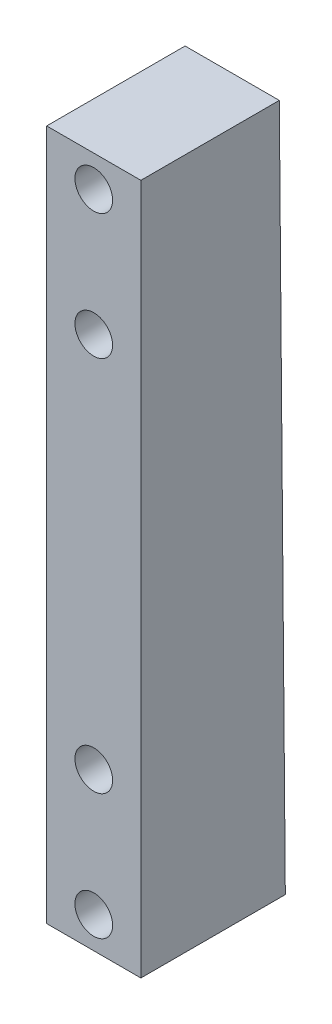
ISO-10303-21;
HEADER;
FILE_DESCRIPTION(('STEP AP214'),'2;1');
FILE_NAME('part.step','',(''),(''),'','','');
FILE_SCHEMA(('AUTOMOTIVE_DESIGN { 1 0 10303 214 1 1 1 1 }'));
ENDSEC;
DATA;
#1=APPLICATION_CONTEXT('core data for automotive mechanical design processes');
#2=APPLICATION_PROTOCOL_DEFINITION('international standard','automotive_design',2000,#1);
#3=PRODUCT_CONTEXT('',#1,'mechanical');
#4=PRODUCT('Part','Part','',(#3));
#5=PRODUCT_RELATED_PRODUCT_CATEGORY('part','',(#4));
#6=PRODUCT_DEFINITION_FORMATION('','',#4);
#7=PRODUCT_DEFINITION_CONTEXT('part definition',#1,'design');
#8=PRODUCT_DEFINITION('design','',#6,#7);
#9=PRODUCT_DEFINITION_SHAPE('','',#8);
#10=(LENGTH_UNIT() NAMED_UNIT(*) SI_UNIT(.MILLI.,.METRE.));
#11=(NAMED_UNIT(*) PLANE_ANGLE_UNIT() SI_UNIT($,.RADIAN.));
#12=(NAMED_UNIT(*) SI_UNIT($,.STERADIAN.) SOLID_ANGLE_UNIT());
#13=UNCERTAINTY_MEASURE_WITH_UNIT(LENGTH_MEASURE(1.E-05),#10,'distance_accuracy_value','');
#14=(GEOMETRIC_REPRESENTATION_CONTEXT(3) GLOBAL_UNCERTAINTY_ASSIGNED_CONTEXT((#13)) GLOBAL_UNIT_ASSIGNED_CONTEXT((#10,
#11,#12)) REPRESENTATION_CONTEXT('',''));
#15=CARTESIAN_POINT('',(0.,0.,0.));
#16=DIRECTION('',(0.,0.,1.));
#17=DIRECTION('',(1.,0.,0.));
#18=AXIS2_PLACEMENT_3D('',#15,#16,#17);
#19=CARTESIAN_POINT('',(7.5,-55.,0.));
#20=DIRECTION('',(0.,0.,1.));
#21=DIRECTION('',(1.,0.,0.));
#22=AXIS2_PLACEMENT_3D('',#19,#20,#21);
#23=PLANE('',#22);
#24=CARTESIAN_POINT('',(0.,50.,0.));
#25=DIRECTION('',(0.,0.,1.));
#26=DIRECTION('',(1.,0.,0.));
#27=AXIS2_PLACEMENT_3D('',#24,#25,#26);
#28=CIRCLE('',#27,3.);
#29=CARTESIAN_POINT('',(3.,50.,0.));
#30=VERTEX_POINT('',#29);
#31=EDGE_CURVE('E120',#30,#30,#28,.T.);
#32=ORIENTED_EDGE('',*,*,#31,.F.);
#33=EDGE_LOOP('',(#32));
#34=FACE_BOUND('',#33,.T.);
#35=CARTESIAN_POINT('',(0.,-50.,0.));
#36=DIRECTION('',(0.,0.,1.));
#37=DIRECTION('',(1.,0.,0.));
#38=AXIS2_PLACEMENT_3D('',#35,#36,#37);
#39=CIRCLE('',#38,3.);
#40=CARTESIAN_POINT('',(3.,-50.,0.));
#41=VERTEX_POINT('',#40);
#42=EDGE_CURVE('E111',#41,#41,#39,.T.);
#43=ORIENTED_EDGE('',*,*,#42,.F.);
#44=EDGE_LOOP('',(#43));
#45=FACE_BOUND('',#44,.T.);
#46=CARTESIAN_POINT('',(0.,30.,0.));
#47=DIRECTION('',(0.,0.,1.));
#48=DIRECTION('',(1.,0.,0.));
#49=AXIS2_PLACEMENT_3D('',#46,#47,#48);
#50=CIRCLE('',#49,2.99999999999999);
#51=CARTESIAN_POINT('',(2.99999999999999,30.,0.));
#52=VERTEX_POINT('',#51);
#53=EDGE_CURVE('E102',#52,#52,#50,.T.);
#54=ORIENTED_EDGE('',*,*,#53,.F.);
#55=EDGE_LOOP('',(#54));
#56=FACE_BOUND('',#55,.T.);
#57=CARTESIAN_POINT('',(0.,-30.,0.));
#58=DIRECTION('',(0.,0.,1.));
#59=DIRECTION('',(1.,0.,0.));
#60=AXIS2_PLACEMENT_3D('',#57,#58,#59);
#61=CIRCLE('',#60,2.99999999999999);
#62=CARTESIAN_POINT('',(2.99999999999999,-30.,0.));
#63=VERTEX_POINT('',#62);
#64=EDGE_CURVE('E96',#63,#63,#61,.T.);
#65=ORIENTED_EDGE('',*,*,#64,.F.);
#66=EDGE_LOOP('',(#65));
#67=FACE_BOUND('',#66,.T.);
#68=DIRECTION('',(0.,1.,0.));
#69=VECTOR('',#68,1.);
#70=CARTESIAN_POINT('',(-7.5,-55.,0.));
#71=LINE('',#70,#69);
#72=CARTESIAN_POINT('',(-7.5,-55.,0.));
#73=VERTEX_POINT('',#72);
#74=CARTESIAN_POINT('',(-7.5,55.,0.));
#75=VERTEX_POINT('',#74);
#76=EDGE_CURVE('E74',#73,#75,#71,.T.);
#77=ORIENTED_EDGE('',*,*,#76,.F.);
#78=DIRECTION('',(-1.,0.,0.));
#79=VECTOR('',#78,1.);
#80=CARTESIAN_POINT('',(7.5,-55.,0.));
#81=LINE('',#80,#79);
#82=CARTESIAN_POINT('',(7.5,-55.,0.));
#83=VERTEX_POINT('',#82);
#84=EDGE_CURVE('E11',#83,#73,#81,.T.);
#85=ORIENTED_EDGE('',*,*,#84,.F.);
#86=DIRECTION('',(0.,1.,0.));
#87=VECTOR('',#86,1.);
#88=CARTESIAN_POINT('',(7.5,-55.,0.));
#89=LINE('',#88,#87);
#90=CARTESIAN_POINT('',(7.5,55.,0.));
#91=VERTEX_POINT('',#90);
#92=EDGE_CURVE('E84',#83,#91,#89,.T.);
#93=ORIENTED_EDGE('',*,*,#92,.T.);
#94=DIRECTION('',(-1.,0.,0.));
#95=VECTOR('',#94,1.);
#96=CARTESIAN_POINT('',(7.5,55.,0.));
#97=LINE('',#96,#95);
#98=EDGE_CURVE('E75',#91,#75,#97,.T.);
#99=ORIENTED_EDGE('',*,*,#98,.T.);
#100=EDGE_LOOP('',(#77,#85,#93,#99));
#101=FACE_BOUND('',#100,.T.);
#102=ADVANCED_FACE('F33',(#34,#45,#56,#67,#101),#23,.T.);
#103=CARTESIAN_POINT('',(7.5,-55.,-23.));
#104=DIRECTION('',(0.,-1.,0.));
#105=DIRECTION('',(0.,0.,-1.));
#106=AXIS2_PLACEMENT_3D('',#103,#104,#105);
#107=PLANE('',#106);
#108=DIRECTION('',(0.,0.,1.));
#109=VECTOR('',#108,1.);
#110=CARTESIAN_POINT('',(-7.5,-55.,-23.));
#111=LINE('',#110,#109);
#112=CARTESIAN_POINT('',(-7.5,-55.,-23.));
#113=VERTEX_POINT('',#112);
#114=EDGE_CURVE('E70',#113,#73,#111,.T.);
#115=ORIENTED_EDGE('',*,*,#114,.F.);
#116=DIRECTION('',(-1.,0.,0.));
#117=VECTOR('',#116,1.);
#118=CARTESIAN_POINT('',(7.5,-55.,-23.));
#119=LINE('',#118,#117);
#120=CARTESIAN_POINT('',(7.5,-55.,-23.));
#121=VERTEX_POINT('',#120);
#122=EDGE_CURVE('E42',#121,#113,#119,.T.);
#123=ORIENTED_EDGE('',*,*,#122,.F.);
#124=DIRECTION('',(0.,0.,1.));
#125=VECTOR('',#124,1.);
#126=CARTESIAN_POINT('',(7.5,-55.,-23.));
#127=LINE('',#126,#125);
#128=EDGE_CURVE('E72',#121,#83,#127,.T.);
#129=ORIENTED_EDGE('',*,*,#128,.T.);
#130=ORIENTED_EDGE('',*,*,#84,.T.);
#131=EDGE_LOOP('',(#115,#123,#129,#130));
#132=FACE_BOUND('',#131,.T.);
#133=ADVANCED_FACE('F68',(#132),#107,.T.);
#134=CARTESIAN_POINT('',(7.5,55.,0.));
#135=DIRECTION('',(0.,1.,0.));
#136=DIRECTION('',(0.,0.,1.));
#137=AXIS2_PLACEMENT_3D('',#134,#135,#136);
#138=PLANE('',#137);
#139=DIRECTION('',(1.,0.,0.));
#140=VECTOR('',#139,1.);
#141=CARTESIAN_POINT('',(-7.5,55.,-22.0400445430173));
#142=LINE('',#141,#140);
#143=CARTESIAN_POINT('',(-7.5,55.,-22.0400445430173));
#144=VERTEX_POINT('',#143);
#145=CARTESIAN_POINT('',(7.5,55.,-22.0400445430173));
#146=VERTEX_POINT('',#145);
#147=EDGE_CURVE('E126',#144,#146,#142,.T.);
#148=ORIENTED_EDGE('',*,*,#147,.F.);
#149=DIRECTION('',(0.,0.,-1.));
#150=VECTOR('',#149,1.);
#151=CARTESIAN_POINT('',(-7.5,55.,0.));
#152=LINE('',#151,#150);
#153=EDGE_CURVE('E79',#75,#144,#152,.T.);
#154=ORIENTED_EDGE('',*,*,#153,.F.);
#155=ORIENTED_EDGE('',*,*,#98,.F.);
#156=DIRECTION('',(0.,0.,-1.));
#157=VECTOR('',#156,1.);
#158=CARTESIAN_POINT('',(7.5,55.,0.));
#159=LINE('',#158,#157);
#160=EDGE_CURVE('E86',#91,#146,#159,.T.);
#161=ORIENTED_EDGE('',*,*,#160,.T.);
#162=EDGE_LOOP('',(#148,#154,#155,#161));
#163=FACE_BOUND('',#162,.T.);
#164=ADVANCED_FACE('F143',(#163),#138,.T.);
#165=CARTESIAN_POINT('',(7.5,0.,0.));
#166=DIRECTION('',(-1.,0.,0.));
#167=DIRECTION('',(0.,0.,1.));
#168=AXIS2_PLACEMENT_3D('',#165,#166,#167);
#169=PLANE('',#168);
#170=ORIENTED_EDGE('',*,*,#128,.F.);
#171=DIRECTION('',(0.,-0.999961923064171,-0.008726535498367));
#172=VECTOR('',#171,1.);
#173=CARTESIAN_POINT('',(7.5,-55.,-23.));
#174=LINE('',#173,#172);
#175=EDGE_CURVE('E129',#146,#121,#174,.T.);
#176=ORIENTED_EDGE('',*,*,#175,.F.);
#177=ORIENTED_EDGE('',*,*,#160,.F.);
#178=ORIENTED_EDGE('',*,*,#92,.F.);
#179=EDGE_LOOP('',(#170,#176,#177,#178));
#180=FACE_BOUND('',#179,.T.);
#181=ADVANCED_FACE('F141',(#180),#169,.F.);
#182=CARTESIAN_POINT('',(-7.5,0.,0.));
#183=DIRECTION('',(-1.,0.,0.));
#184=DIRECTION('',(0.,0.,1.));
#185=AXIS2_PLACEMENT_3D('',#182,#183,#184);
#186=PLANE('',#185);
#187=DIRECTION('',(0.,-0.999961923064171,-0.008726535498367));
#188=VECTOR('',#187,1.);
#189=CARTESIAN_POINT('',(-7.5,-55.,-23.));
#190=LINE('',#189,#188);
#191=EDGE_CURVE('E83',#144,#113,#190,.T.);
#192=ORIENTED_EDGE('',*,*,#191,.T.);
#193=ORIENTED_EDGE('',*,*,#114,.T.);
#194=ORIENTED_EDGE('',*,*,#76,.T.);
#195=ORIENTED_EDGE('',*,*,#153,.T.);
#196=EDGE_LOOP('',(#192,#193,#194,#195));
#197=FACE_BOUND('',#196,.T.);
#198=ADVANCED_FACE('F82',(#197),#186,.T.);
#199=CARTESIAN_POINT('',(0.,-30.,-6.01));
#200=DIRECTION('',(0.,0.,1.));
#201=DIRECTION('',(1.,0.,0.));
#202=AXIS2_PLACEMENT_3D('',#199,#200,#201);
#203=CONICAL_SURFACE('',#202,2.99999999999999,1.0297442586969);
#204=CARTESIAN_POINT('',(0.,-30.,-7.812581857));
#205=VERTEX_POINT('',#204);
#206=VERTEX_LOOP('',#205);
#207=FACE_BOUND('',#206,.T.);
#208=CARTESIAN_POINT('',(0.,-30.,-6.01));
#209=DIRECTION('',(0.,0.,1.));
#210=DIRECTION('',(1.,0.,0.));
#211=AXIS2_PLACEMENT_3D('',#208,#209,#210);
#212=CIRCLE('',#211,2.99999999999999);
#213=CARTESIAN_POINT('',(2.99999999999999,-30.,-6.01));
#214=VERTEX_POINT('',#213);
#215=EDGE_CURVE('E80',#214,#214,#212,.T.);
#216=ORIENTED_EDGE('',*,*,#215,.T.);
#217=EDGE_LOOP('',(#216));
#218=FACE_BOUND('',#217,.T.);
#219=ADVANCED_FACE('F151',(#207,#218),#203,.F.);
#220=CARTESIAN_POINT('',(0.,-30.,0.));
#221=DIRECTION('',(0.,0.,1.));
#222=DIRECTION('',(1.,0.,0.));
#223=AXIS2_PLACEMENT_3D('',#220,#221,#222);
#224=CYLINDRICAL_SURFACE('',#223,2.99999999999999);
#225=ORIENTED_EDGE('',*,*,#215,.F.);
#226=EDGE_LOOP('',(#225));
#227=FACE_BOUND('',#226,.T.);
#228=ORIENTED_EDGE('',*,*,#64,.T.);
#229=EDGE_LOOP('',(#228));
#230=FACE_BOUND('',#229,.T.);
#231=ADVANCED_FACE('F154',(#227,#230),#224,.F.);
#232=CARTESIAN_POINT('',(0.,30.,-6.01));
#233=DIRECTION('',(0.,0.,1.));
#234=DIRECTION('',(1.,0.,0.));
#235=AXIS2_PLACEMENT_3D('',#232,#233,#234);
#236=CONICAL_SURFACE('',#235,2.99999999999999,1.0297442586969);
#237=CARTESIAN_POINT('',(0.,30.,-7.812581857));
#238=VERTEX_POINT('',#237);
#239=VERTEX_LOOP('',#238);
#240=FACE_BOUND('',#239,.T.);
#241=CARTESIAN_POINT('',(0.,30.,-6.01));
#242=DIRECTION('',(0.,0.,1.));
#243=DIRECTION('',(1.,0.,0.));
#244=AXIS2_PLACEMENT_3D('',#241,#242,#243);
#245=CIRCLE('',#244,2.99999999999999);
#246=CARTESIAN_POINT('',(2.99999999999999,30.,-6.01));
#247=VERTEX_POINT('',#246);
#248=EDGE_CURVE('E99',#247,#247,#245,.T.);
#249=ORIENTED_EDGE('',*,*,#248,.T.);
#250=EDGE_LOOP('',(#249));
#251=FACE_BOUND('',#250,.T.);
#252=ADVANCED_FACE('F160',(#240,#251),#236,.F.);
#253=CARTESIAN_POINT('',(0.,30.,0.));
#254=DIRECTION('',(0.,0.,1.));
#255=DIRECTION('',(1.,0.,0.));
#256=AXIS2_PLACEMENT_3D('',#253,#254,#255);
#257=CYLINDRICAL_SURFACE('',#256,2.99999999999999);
#258=ORIENTED_EDGE('',*,*,#248,.F.);
#259=EDGE_LOOP('',(#258));
#260=FACE_BOUND('',#259,.T.);
#261=ORIENTED_EDGE('',*,*,#53,.T.);
#262=EDGE_LOOP('',(#261));
#263=FACE_BOUND('',#262,.T.);
#264=ADVANCED_FACE('F177',(#260,#263),#257,.F.);
#265=CARTESIAN_POINT('',(0.,-50.,0.));
#266=DIRECTION('',(0.,0.,1.));
#267=DIRECTION('',(1.,0.,0.));
#268=AXIS2_PLACEMENT_3D('',#265,#266,#267);
#269=CYLINDRICAL_SURFACE('',#268,2.10000000000001);
#270=CARTESIAN_POINT('',(0.,-50.,-22.9563656610462));
#271=DIRECTION('',(0.,-0.008726535498367,0.999961923064171));
#272=DIRECTION('',(0.,0.999961923064171,0.008726535498367));
#273=AXIS2_PLACEMENT_3D('',#270,#271,#272);
#274=ELLIPSE('',#273,2.10007996461005,2.10000000000001);
#275=CARTESIAN_POINT('',(0.,-47.9,-22.9380392386857));
#276=VERTEX_POINT('',#275);
#277=EDGE_CURVE('E123',#276,#276,#274,.F.);
#278=ORIENTED_EDGE('',*,*,#277,.T.);
#279=EDGE_LOOP('',(#278));
#280=FACE_BOUND('',#279,.T.);
#281=CARTESIAN_POINT('',(0.,-50.,-6.54077455899997));
#282=DIRECTION('',(0.,0.,1.));
#283=DIRECTION('',(1.,0.,0.));
#284=AXIS2_PLACEMENT_3D('',#281,#282,#283);
#285=CIRCLE('',#284,2.10000000000001);
#286=CARTESIAN_POINT('',(2.10000000000001,-50.,-6.54077455899997));
#287=VERTEX_POINT('',#286);
#288=EDGE_CURVE('E105',#287,#287,#285,.T.);
#289=ORIENTED_EDGE('',*,*,#288,.T.);
#290=EDGE_LOOP('',(#289));
#291=FACE_BOUND('',#290,.T.);
#292=ADVANCED_FACE('F179',(#280,#291),#269,.F.);
#293=CARTESIAN_POINT('',(0.,-50.,-6.));
#294=DIRECTION('',(0.,0.,1.));
#295=DIRECTION('',(1.,0.,0.));
#296=AXIS2_PLACEMENT_3D('',#293,#294,#295);
#297=CONICAL_SURFACE('',#296,3.,1.02974425714581);
#298=ORIENTED_EDGE('',*,*,#288,.F.);
#299=EDGE_LOOP('',(#298));
#300=FACE_BOUND('',#299,.T.);
#301=CARTESIAN_POINT('',(0.,-50.,-6.));
#302=DIRECTION('',(0.,0.,1.));
#303=DIRECTION('',(1.,0.,0.));
#304=AXIS2_PLACEMENT_3D('',#301,#302,#303);
#305=CIRCLE('',#304,3.);
#306=CARTESIAN_POINT('',(3.,-50.,-6.));
#307=VERTEX_POINT('',#306);
#308=EDGE_CURVE('E108',#307,#307,#305,.T.);
#309=ORIENTED_EDGE('',*,*,#308,.T.);
#310=EDGE_LOOP('',(#309));
#311=FACE_BOUND('',#310,.T.);
#312=ADVANCED_FACE('F187',(#300,#311),#297,.F.);
#313=CARTESIAN_POINT('',(0.,-50.,0.));
#314=DIRECTION('',(0.,0.,1.));
#315=DIRECTION('',(1.,0.,0.));
#316=AXIS2_PLACEMENT_3D('',#313,#314,#315);
#317=CYLINDRICAL_SURFACE('',#316,3.);
#318=ORIENTED_EDGE('',*,*,#308,.F.);
#319=EDGE_LOOP('',(#318));
#320=FACE_BOUND('',#319,.T.);
#321=ORIENTED_EDGE('',*,*,#42,.T.);
#322=EDGE_LOOP('',(#321));
#323=FACE_BOUND('',#322,.T.);
#324=ADVANCED_FACE('F223',(#320,#323),#317,.F.);
#325=CARTESIAN_POINT('',(0.,50.,0.));
#326=DIRECTION('',(0.,0.,1.));
#327=DIRECTION('',(1.,0.,0.));
#328=AXIS2_PLACEMENT_3D('',#325,#326,#327);
#329=CYLINDRICAL_SURFACE('',#328,2.10000000000001);
#330=CARTESIAN_POINT('',(0.,50.,-22.0836788819711));
#331=DIRECTION('',(0.,-0.008726535498367,0.999961923064171));
#332=DIRECTION('',(0.,0.999961923064171,0.008726535498367));
#333=AXIS2_PLACEMENT_3D('',#330,#331,#332);
#334=ELLIPSE('',#333,2.10007996461005,2.10000000000001);
#335=CARTESIAN_POINT('',(0.,52.1,-22.0653524596105));
#336=VERTEX_POINT('',#335);
#337=EDGE_CURVE('E36',#336,#336,#334,.F.);
#338=ORIENTED_EDGE('',*,*,#337,.T.);
#339=EDGE_LOOP('',(#338));
#340=FACE_BOUND('',#339,.T.);
#341=CARTESIAN_POINT('',(0.,50.,-6.54077455899997));
#342=DIRECTION('',(0.,0.,1.));
#343=DIRECTION('',(1.,0.,0.));
#344=AXIS2_PLACEMENT_3D('',#341,#342,#343);
#345=CIRCLE('',#344,2.10000000000001);
#346=CARTESIAN_POINT('',(2.10000000000001,50.,-6.54077455899997));
#347=VERTEX_POINT('',#346);
#348=EDGE_CURVE('E114',#347,#347,#345,.T.);
#349=ORIENTED_EDGE('',*,*,#348,.T.);
#350=EDGE_LOOP('',(#349));
#351=FACE_BOUND('',#350,.T.);
#352=ADVANCED_FACE('F218',(#340,#351),#329,.F.);
#353=CARTESIAN_POINT('',(0.,50.,-6.));
#354=DIRECTION('',(0.,0.,1.));
#355=DIRECTION('',(1.,0.,0.));
#356=AXIS2_PLACEMENT_3D('',#353,#354,#355);
#357=CONICAL_SURFACE('',#356,3.,1.02974425714581);
#358=ORIENTED_EDGE('',*,*,#348,.F.);
#359=EDGE_LOOP('',(#358));
#360=FACE_BOUND('',#359,.T.);
#361=CARTESIAN_POINT('',(0.,50.,-6.));
#362=DIRECTION('',(0.,0.,1.));
#363=DIRECTION('',(1.,0.,0.));
#364=AXIS2_PLACEMENT_3D('',#361,#362,#363);
#365=CIRCLE('',#364,3.);
#366=CARTESIAN_POINT('',(3.,50.,-6.));
#367=VERTEX_POINT('',#366);
#368=EDGE_CURVE('E117',#367,#367,#365,.T.);
#369=ORIENTED_EDGE('',*,*,#368,.T.);
#370=EDGE_LOOP('',(#369));
#371=FACE_BOUND('',#370,.T.);
#372=ADVANCED_FACE('F222',(#360,#371),#357,.F.);
#373=CARTESIAN_POINT('',(0.,50.,0.));
#374=DIRECTION('',(0.,0.,1.));
#375=DIRECTION('',(1.,0.,0.));
#376=AXIS2_PLACEMENT_3D('',#373,#374,#375);
#377=CYLINDRICAL_SURFACE('',#376,3.);
#378=ORIENTED_EDGE('',*,*,#368,.F.);
#379=EDGE_LOOP('',(#378));
#380=FACE_BOUND('',#379,.T.);
#381=ORIENTED_EDGE('',*,*,#31,.T.);
#382=EDGE_LOOP('',(#381));
#383=FACE_BOUND('',#382,.T.);
#384=ADVANCED_FACE('F233',(#380,#383),#377,.F.);
#385=CARTESIAN_POINT('',(-7.5,-55.,-23.));
#386=DIRECTION('',(0.,-0.008726535498367,0.999961923064171));
#387=DIRECTION('',(0.,-0.999961923064171,-0.008726535498367));
#388=AXIS2_PLACEMENT_3D('',#385,#386,#387);
#389=PLANE('',#388);
#390=ORIENTED_EDGE('',*,*,#337,.F.);
#391=EDGE_LOOP('',(#390));
#392=FACE_BOUND('',#391,.T.);
#393=ORIENTED_EDGE('',*,*,#175,.T.);
#394=ORIENTED_EDGE('',*,*,#122,.T.);
#395=ORIENTED_EDGE('',*,*,#191,.F.);
#396=ORIENTED_EDGE('',*,*,#147,.T.);
#397=EDGE_LOOP('',(#393,#394,#395,#396));
#398=FACE_BOUND('',#397,.T.);
#399=ORIENTED_EDGE('',*,*,#277,.F.);
#400=EDGE_LOOP('',(#399));
#401=FACE_BOUND('',#400,.T.);
#402=ADVANCED_FACE('F133',(#392,#398,#401),#389,.F.);
#403=CLOSED_SHELL('',(#102,#133,#164,#181,#198,#219,#231,#252,#264,#292,#312,#324,#352,#372,
#384,#402));
#404=MANIFOLD_SOLID_BREP('B2',#403);
#405=ADVANCED_BREP_SHAPE_REPRESENTATION('',(#18,#404),#14);
#406=SHAPE_DEFINITION_REPRESENTATION(#9,#405);
ENDSEC;
END-ISO-10303-21;
